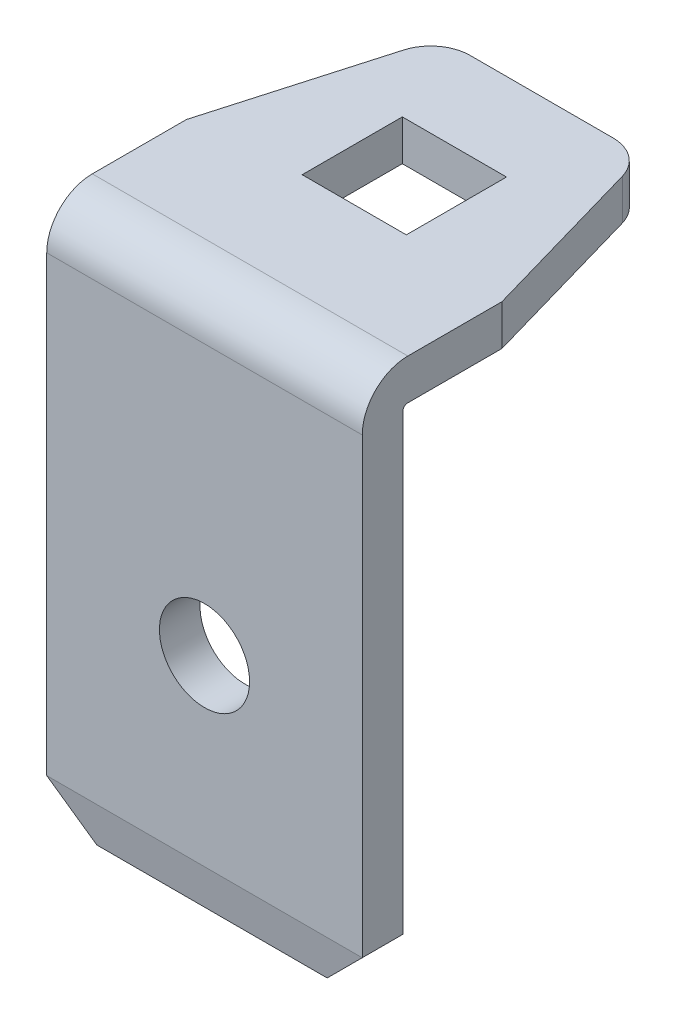
ISO-10303-21;
HEADER;
FILE_DESCRIPTION(('STEP AP214'),'2;1');
FILE_NAME('part.step','',(''),(''),'','','');
FILE_SCHEMA(('AUTOMOTIVE_DESIGN { 1 0 10303 214 1 1 1 1 }'));
ENDSEC;
DATA;
#1=APPLICATION_CONTEXT('core data for automotive mechanical design processes');
#2=APPLICATION_PROTOCOL_DEFINITION('international standard','automotive_design',2000,#1);
#3=PRODUCT_CONTEXT('',#1,'mechanical');
#4=PRODUCT('Part','Part','',(#3));
#5=PRODUCT_RELATED_PRODUCT_CATEGORY('part','',(#4));
#6=PRODUCT_DEFINITION_FORMATION('','',#4);
#7=PRODUCT_DEFINITION_CONTEXT('part definition',#1,'design');
#8=PRODUCT_DEFINITION('design','',#6,#7);
#9=PRODUCT_DEFINITION_SHAPE('','',#8);
#10=(LENGTH_UNIT() NAMED_UNIT(*) SI_UNIT(.MILLI.,.METRE.));
#11=(NAMED_UNIT(*) PLANE_ANGLE_UNIT() SI_UNIT($,.RADIAN.));
#12=(NAMED_UNIT(*) SI_UNIT($,.STERADIAN.) SOLID_ANGLE_UNIT());
#13=UNCERTAINTY_MEASURE_WITH_UNIT(LENGTH_MEASURE(1.E-05),#10,'distance_accuracy_value','');
#14=(GEOMETRIC_REPRESENTATION_CONTEXT(3) GLOBAL_UNCERTAINTY_ASSIGNED_CONTEXT((#13)) GLOBAL_UNIT_ASSIGNED_CONTEXT((#10,
#11,#12)) REPRESENTATION_CONTEXT('',''));
#15=CARTESIAN_POINT('',(0.,0.,0.));
#16=DIRECTION('',(0.,0.,1.));
#17=DIRECTION('',(1.,0.,0.));
#18=AXIS2_PLACEMENT_3D('',#15,#16,#17);
#19=CARTESIAN_POINT('',(6.092807699581,-20.94626181965,38.4492));
#20=DIRECTION('',(0.,-1.,0.));
#21=DIRECTION('',(0.,0.,-1.));
#22=AXIS2_PLACEMENT_3D('',#19,#20,#21);
#23=CYLINDRICAL_SURFACE('',#22,0.79);
#24=CARTESIAN_POINT('',(6.092807699581,-20.1192225422,38.4492));
#25=DIRECTION('',(0.,-1.,0.));
#26=DIRECTION('',(0.,0.,-1.));
#27=AXIS2_PLACEMENT_3D('',#24,#25,#26);
#28=CIRCLE('',#27,0.79);
#29=CARTESIAN_POINT('',(5.33341095978971,-20.1192225422,38.2314464889024));
#30=VERTEX_POINT('',#29);
#31=CARTESIAN_POINT('',(6.092807699581,-20.1192225422,37.6592));
#32=VERTEX_POINT('',#31);
#33=EDGE_CURVE('E293',#30,#32,#28,.T.);
#34=ORIENTED_EDGE('',*,*,#33,.T.);
#35=DIRECTION('',(0.,1.,0.));
#36=VECTOR('',#35,1.);
#37=CARTESIAN_POINT('',(6.092807699581,-20.5242225422,37.6592));
#38=LINE('',#37,#36);
#39=CARTESIAN_POINT('',(6.092807699581,-20.9292225422,37.6592));
#40=VERTEX_POINT('',#39);
#41=EDGE_CURVE('E333',#32,#40,#38,.F.);
#42=ORIENTED_EDGE('',*,*,#41,.T.);
#43=CARTESIAN_POINT('',(6.092807699581,-20.9292225422,38.4492));
#44=DIRECTION('',(0.,-1.,0.));
#45=DIRECTION('',(0.,0.,-1.));
#46=AXIS2_PLACEMENT_3D('',#43,#44,#45);
#47=CIRCLE('',#46,0.79);
#48=CARTESIAN_POINT('',(5.33341095978971,-20.9292225422,38.2314464889024));
#49=VERTEX_POINT('',#48);
#50=EDGE_CURVE('E273',#49,#40,#47,.T.);
#51=ORIENTED_EDGE('',*,*,#50,.F.);
#52=DIRECTION('',(0.,1.,0.));
#53=VECTOR('',#52,1.);
#54=CARTESIAN_POINT('',(5.33341095979072,-20.5242225422,38.2314464889002));
#55=LINE('',#54,#53);
#56=EDGE_CURVE('E319',#30,#49,#55,.F.);
#57=ORIENTED_EDGE('',*,*,#56,.F.);
#58=EDGE_LOOP('',(#34,#42,#51,#57));
#59=FACE_BOUND('',#58,.T.);
#60=ADVANCED_FACE('F16',(#59),#23,.T.);
#61=CARTESIAN_POINT('',(7.5175,-20.5242225422,37.6592));
#62=DIRECTION('',(0.,0.,1.));
#63=DIRECTION('',(1.,0.,0.));
#64=AXIS2_PLACEMENT_3D('',#61,#62,#63);
#65=PLANE('',#64);
#66=DIRECTION('',(0.,1.,0.));
#67=VECTOR('',#66,1.);
#68=CARTESIAN_POINT('',(8.942192300419,-20.10218326475,37.6592));
#69=LINE('',#68,#67);
#70=CARTESIAN_POINT('',(8.942192300419,-20.9292225422,37.6592));
#71=VERTEX_POINT('',#70);
#72=CARTESIAN_POINT('',(8.942192300419,-20.1192225422,37.6592));
#73=VERTEX_POINT('',#72);
#74=EDGE_CURVE('E327',#71,#73,#69,.T.);
#75=ORIENTED_EDGE('',*,*,#74,.F.);
#76=DIRECTION('',(1.,0.,0.));
#77=VECTOR('',#76,1.);
#78=CARTESIAN_POINT('',(7.5175,-20.9292225422,37.6592));
#79=LINE('',#78,#77);
#80=EDGE_CURVE('E270',#40,#71,#79,.T.);
#81=ORIENTED_EDGE('',*,*,#80,.F.);
#82=ORIENTED_EDGE('',*,*,#41,.F.);
#83=DIRECTION('',(1.,0.,0.));
#84=VECTOR('',#83,1.);
#85=CARTESIAN_POINT('',(7.5175,-20.1192225422,37.6592));
#86=LINE('',#85,#84);
#87=EDGE_CURVE('E291',#32,#73,#86,.T.);
#88=ORIENTED_EDGE('',*,*,#87,.T.);
#89=EDGE_LOOP('',(#75,#81,#82,#88));
#90=FACE_BOUND('',#89,.T.);
#91=ADVANCED_FACE('F393',(#90),#65,.F.);
#92=CARTESIAN_POINT('',(8.942192300419,-20.10218326475,38.4492));
#93=DIRECTION('',(0.,1.,0.));
#94=DIRECTION('',(0.,0.,1.));
#95=AXIS2_PLACEMENT_3D('',#92,#93,#94);
#96=CYLINDRICAL_SURFACE('',#95,0.79);
#97=CARTESIAN_POINT('',(8.942192300419,-20.9292225422,38.4492));
#98=DIRECTION('',(0.,1.,0.));
#99=DIRECTION('',(0.,0.,1.));
#100=AXIS2_PLACEMENT_3D('',#97,#98,#99);
#101=CIRCLE('',#100,0.79);
#102=CARTESIAN_POINT('',(9.70158904021172,-20.9292225422,38.231446488902));
#103=VERTEX_POINT('',#102);
#104=EDGE_CURVE('E267',#71,#103,#101,.F.);
#105=ORIENTED_EDGE('',*,*,#104,.F.);
#106=ORIENTED_EDGE('',*,*,#74,.T.);
#107=CARTESIAN_POINT('',(8.942192300419,-20.1192225422,38.4492));
#108=DIRECTION('',(0.,1.,0.));
#109=DIRECTION('',(0.,0.,1.));
#110=AXIS2_PLACEMENT_3D('',#107,#108,#109);
#111=CIRCLE('',#110,0.79);
#112=CARTESIAN_POINT('',(9.70158904021172,-20.1192225422,38.231446488902));
#113=VERTEX_POINT('',#112);
#114=EDGE_CURVE('E288',#73,#113,#111,.F.);
#115=ORIENTED_EDGE('',*,*,#114,.T.);
#116=DIRECTION('',(0.,1.,0.));
#117=VECTOR('',#116,1.);
#118=CARTESIAN_POINT('',(9.70158904021214,-20.5242225422,38.2314464888994));
#119=LINE('',#118,#117);
#120=EDGE_CURVE('E325',#113,#103,#119,.F.);
#121=ORIENTED_EDGE('',*,*,#120,.T.);
#122=EDGE_LOOP('',(#105,#106,#115,#121));
#123=FACE_BOUND('',#122,.T.);
#124=ADVANCED_FACE('F396',(#123),#96,.T.);
#125=CARTESIAN_POINT('',(10.18454452011,-20.5242225422,39.91571240522));
#126=DIRECTION('',(-0.961261695938003,0.,0.275637355818101));
#127=DIRECTION('',(0.275637355818101,0.,0.961261695938003));
#128=AXIS2_PLACEMENT_3D('',#125,#126,#127);
#129=PLANE('',#128);
#130=DIRECTION('',(0.275637355816688,0.,0.961261695938408));
#131=VECTOR('',#130,1.);
#132=CARTESIAN_POINT('',(9.70158904021,-20.9292225422,38.2314464889));
#133=LINE('',#132,#131);
#134=CARTESIAN_POINT('',(10.6675000000024,-20.9292225422,41.5999783215393));
#135=VERTEX_POINT('',#134);
#136=EDGE_CURVE('E264',#103,#135,#133,.T.);
#137=ORIENTED_EDGE('',*,*,#136,.F.);
#138=ORIENTED_EDGE('',*,*,#120,.F.);
#139=DIRECTION('',(0.275637355816688,0.,0.961261695938408));
#140=VECTOR('',#139,1.);
#141=CARTESIAN_POINT('',(9.70158904021,-20.1192225422,38.2314464889));
#142=LINE('',#141,#140);
#143=CARTESIAN_POINT('',(10.6675000000024,-20.1192225422,41.5999783215393));
#144=VERTEX_POINT('',#143);
#145=EDGE_CURVE('E285',#113,#144,#142,.T.);
#146=ORIENTED_EDGE('',*,*,#145,.T.);
#147=DIRECTION('',(0.,1.,0.));
#148=VECTOR('',#147,1.);
#149=CARTESIAN_POINT('',(10.6675000000071,-20.5242225422,41.599978321538));
#150=LINE('',#149,#148);
#151=EDGE_CURVE('E324',#135,#144,#150,.T.);
#152=ORIENTED_EDGE('',*,*,#151,.F.);
#153=EDGE_LOOP('',(#137,#138,#146,#152));
#154=FACE_BOUND('',#153,.T.);
#155=ADVANCED_FACE('F356',(#154),#129,.F.);
#156=CARTESIAN_POINT('',(4.850455479895,-20.5242225422,39.91571240522));
#157=DIRECTION('',(-0.961261695938291,0.,-0.275637355817097));
#158=DIRECTION('',(-0.275637355817097,0.,0.961261695938291));
#159=AXIS2_PLACEMENT_3D('',#156,#157,#158);
#160=PLANE('',#159);
#161=DIRECTION('',(0.,1.,0.));
#162=VECTOR('',#161,1.);
#163=CARTESIAN_POINT('',(4.36749999999928,-20.5242225422,41.5999783215398));
#164=LINE('',#163,#162);
#165=CARTESIAN_POINT('',(4.36749999999976,-20.9292225422,41.5999783215399));
#166=VERTEX_POINT('',#165);
#167=CARTESIAN_POINT('',(4.36749999999976,-20.1192225422,41.5999783215399));
#168=VERTEX_POINT('',#167);
#169=EDGE_CURVE('E317',#166,#168,#164,.T.);
#170=ORIENTED_EDGE('',*,*,#169,.T.);
#171=DIRECTION('',(0.275637355816688,0.,-0.961261695938408));
#172=VECTOR('',#171,1.);
#173=CARTESIAN_POINT('',(4.3675,-20.1192225422,41.59997832154));
#174=LINE('',#173,#172);
#175=EDGE_CURVE('E294',#168,#30,#174,.T.);
#176=ORIENTED_EDGE('',*,*,#175,.T.);
#177=ORIENTED_EDGE('',*,*,#56,.T.);
#178=DIRECTION('',(0.275637355816688,0.,-0.961261695938408));
#179=VECTOR('',#178,1.);
#180=CARTESIAN_POINT('',(4.3675,-20.9292225422,41.59997832154));
#181=LINE('',#180,#179);
#182=EDGE_CURVE('E258',#166,#49,#181,.T.);
#183=ORIENTED_EDGE('',*,*,#182,.F.);
#184=EDGE_LOOP('',(#170,#176,#177,#183));
#185=FACE_BOUND('',#184,.T.);
#186=ADVANCED_FACE('F386',(#185),#160,.T.);
#187=CARTESIAN_POINT('',(7.5175,-20.5242225422,41.3992));
#188=DIRECTION('',(0.,0.,1.));
#189=DIRECTION('',(1.,0.,0.));
#190=AXIS2_PLACEMENT_3D('',#187,#188,#189);
#191=PLANE('',#190);
#192=DIRECTION('',(1.,0.,0.));
#193=VECTOR('',#192,1.);
#194=CARTESIAN_POINT('',(7.5175,-20.1192225422,41.3992));
#195=LINE('',#194,#193);
#196=CARTESIAN_POINT('',(6.4775,-20.1192225422,41.3992));
#197=VERTEX_POINT('',#196);
#198=CARTESIAN_POINT('',(8.5575,-20.1192225422,41.3992));
#199=VERTEX_POINT('',#198);
#200=EDGE_CURVE('E280',#197,#199,#195,.T.);
#201=ORIENTED_EDGE('',*,*,#200,.T.);
#202=DIRECTION('',(0.,1.,0.));
#203=VECTOR('',#202,1.);
#204=CARTESIAN_POINT('',(8.5575,-20.5242225422,41.3992));
#205=LINE('',#204,#203);
#206=CARTESIAN_POINT('',(8.5575,-20.9292225422,41.3992));
#207=VERTEX_POINT('',#206);
#208=EDGE_CURVE('E314',#207,#199,#205,.T.);
#209=ORIENTED_EDGE('',*,*,#208,.F.);
#210=DIRECTION('',(1.,0.,0.));
#211=VECTOR('',#210,1.);
#212=CARTESIAN_POINT('',(7.5175,-20.9292225422,41.3992));
#213=LINE('',#212,#211);
#214=CARTESIAN_POINT('',(6.4775,-20.9292225422,41.3992));
#215=VERTEX_POINT('',#214);
#216=EDGE_CURVE('E255',#215,#207,#213,.T.);
#217=ORIENTED_EDGE('',*,*,#216,.F.);
#218=DIRECTION('',(0.,1.,0.));
#219=VECTOR('',#218,1.);
#220=CARTESIAN_POINT('',(6.4775,-20.5242225422,41.3992));
#221=LINE('',#220,#219);
#222=EDGE_CURVE('E309',#215,#197,#221,.T.);
#223=ORIENTED_EDGE('',*,*,#222,.T.);
#224=EDGE_LOOP('',(#201,#209,#217,#223));
#225=FACE_BOUND('',#224,.T.);
#226=ADVANCED_FACE('F453',(#225),#191,.F.);
#227=CARTESIAN_POINT('',(8.5575,-20.5242225422,40.3992));
#228=DIRECTION('',(-1.,0.,0.));
#229=DIRECTION('',(0.,0.,1.));
#230=AXIS2_PLACEMENT_3D('',#227,#228,#229);
#231=PLANE('',#230);
#232=DIRECTION('',(0.,1.,0.));
#233=VECTOR('',#232,1.);
#234=CARTESIAN_POINT('',(8.5575,-20.5242225422,39.3992));
#235=LINE('',#234,#233);
#236=CARTESIAN_POINT('',(8.5575,-20.9292225422,39.3992));
#237=VERTEX_POINT('',#236);
#238=CARTESIAN_POINT('',(8.5575,-20.1192225422,39.3992));
#239=VERTEX_POINT('',#238);
#240=EDGE_CURVE('E311',#237,#239,#235,.T.);
#241=ORIENTED_EDGE('',*,*,#240,.F.);
#242=DIRECTION('',(0.,0.,-1.));
#243=VECTOR('',#242,1.);
#244=CARTESIAN_POINT('',(8.5575,-20.9292225422,40.5692));
#245=LINE('',#244,#243);
#246=EDGE_CURVE('E252',#207,#237,#245,.T.);
#247=ORIENTED_EDGE('',*,*,#246,.F.);
#248=ORIENTED_EDGE('',*,*,#208,.T.);
#249=DIRECTION('',(0.,0.,-1.));
#250=VECTOR('',#249,1.);
#251=CARTESIAN_POINT('',(8.5575,-20.1192225422,40.5692));
#252=LINE('',#251,#250);
#253=EDGE_CURVE('E278',#199,#239,#252,.T.);
#254=ORIENTED_EDGE('',*,*,#253,.T.);
#255=EDGE_LOOP('',(#241,#247,#248,#254));
#256=FACE_BOUND('',#255,.T.);
#257=ADVANCED_FACE('F449',(#256),#231,.T.);
#258=CARTESIAN_POINT('',(7.5175,-20.5242225422,39.3992));
#259=DIRECTION('',(0.,0.,1.));
#260=DIRECTION('',(1.,0.,0.));
#261=AXIS2_PLACEMENT_3D('',#258,#259,#260);
#262=PLANE('',#261);
#263=DIRECTION('',(0.,1.,0.));
#264=VECTOR('',#263,1.);
#265=CARTESIAN_POINT('',(6.4775,-20.5242225422,39.3992));
#266=LINE('',#265,#264);
#267=CARTESIAN_POINT('',(6.4775,-20.1192225422,39.3992));
#268=VERTEX_POINT('',#267);
#269=CARTESIAN_POINT('',(6.4775,-20.9292225422,39.3992));
#270=VERTEX_POINT('',#269);
#271=EDGE_CURVE('E149',#268,#270,#266,.F.);
#272=ORIENTED_EDGE('',*,*,#271,.T.);
#273=DIRECTION('',(1.,0.,0.));
#274=VECTOR('',#273,1.);
#275=CARTESIAN_POINT('',(7.5175,-20.9292225422,39.3992));
#276=LINE('',#275,#274);
#277=EDGE_CURVE('E249',#237,#270,#276,.F.);
#278=ORIENTED_EDGE('',*,*,#277,.F.);
#279=ORIENTED_EDGE('',*,*,#240,.T.);
#280=DIRECTION('',(1.,0.,0.));
#281=VECTOR('',#280,1.);
#282=CARTESIAN_POINT('',(7.5175,-20.1192225422,39.3992));
#283=LINE('',#282,#281);
#284=EDGE_CURVE('E275',#239,#268,#283,.F.);
#285=ORIENTED_EDGE('',*,*,#284,.T.);
#286=EDGE_LOOP('',(#272,#278,#279,#285));
#287=FACE_BOUND('',#286,.T.);
#288=ADVANCED_FACE('F445',(#287),#262,.T.);
#289=CARTESIAN_POINT('',(6.4775,-20.5242225422,40.3992));
#290=DIRECTION('',(-1.,0.,0.));
#291=DIRECTION('',(0.,0.,1.));
#292=AXIS2_PLACEMENT_3D('',#289,#290,#291);
#293=PLANE('',#292);
#294=DIRECTION('',(0.,0.,-1.));
#295=VECTOR('',#294,1.);
#296=CARTESIAN_POINT('',(6.4775,-20.1192225422,40.5692));
#297=LINE('',#296,#295);
#298=EDGE_CURVE('E282',#268,#197,#297,.F.);
#299=ORIENTED_EDGE('',*,*,#298,.T.);
#300=ORIENTED_EDGE('',*,*,#222,.F.);
#301=DIRECTION('',(0.,0.,-1.));
#302=VECTOR('',#301,1.);
#303=CARTESIAN_POINT('',(6.4775,-20.9292225422,40.5692));
#304=LINE('',#303,#302);
#305=EDGE_CURVE('E246',#270,#215,#304,.F.);
#306=ORIENTED_EDGE('',*,*,#305,.F.);
#307=ORIENTED_EDGE('',*,*,#271,.F.);
#308=EDGE_LOOP('',(#299,#300,#306,#307));
#309=FACE_BOUND('',#308,.T.);
#310=ADVANCED_FACE('F442',(#309),#293,.F.);
#311=CARTESIAN_POINT('',(7.5175,-30.4942225422,43.6541389668));
#312=DIRECTION('',(0.,0.173648177660102,0.984807753013412));
#313=DIRECTION('',(0.,-0.984807753013412,0.173648177660102));
#314=AXIS2_PLACEMENT_3D('',#311,#312,#313);
#315=PLANE('',#314);
#316=DIRECTION('',(1.,0.,0.));
#317=VECTOR('',#316,1.);
#318=CARTESIAN_POINT('',(7.5175,-30.9192225422,43.7290779336));
#319=LINE('',#318,#317);
#320=CARTESIAN_POINT('',(5.2175,-30.9192225422,43.7290779336));
#321=VERTEX_POINT('',#320);
#322=CARTESIAN_POINT('',(9.8175,-30.9192225422,43.7290779336));
#323=VERTEX_POINT('',#322);
#324=EDGE_CURVE('E230',#321,#323,#319,.T.);
#325=ORIENTED_EDGE('',*,*,#324,.F.);
#326=DIRECTION('',(0.701673843160021,-0.70167384316002,0.123724030204701));
#327=VECTOR('',#326,1.);
#328=CARTESIAN_POINT('',(4.3675,-30.0692225422,43.5792));
#329=LINE('',#328,#327);
#330=CARTESIAN_POINT('',(4.3675,-30.0692225422,43.5792));
#331=VERTEX_POINT('',#330);
#332=EDGE_CURVE('E231',#331,#321,#329,.T.);
#333=ORIENTED_EDGE('',*,*,#332,.F.);
#334=DIRECTION('',(1.,0.,0.));
#335=VECTOR('',#334,1.);
#336=CARTESIAN_POINT('',(7.5175,-30.0692225422,43.5792));
#337=LINE('',#336,#335);
#338=CARTESIAN_POINT('',(10.6675,-30.0692225422,43.5792));
#339=VERTEX_POINT('',#338);
#340=EDGE_CURVE('E157',#331,#339,#337,.T.);
#341=ORIENTED_EDGE('',*,*,#340,.T.);
#342=DIRECTION('',(-0.70167384316002,-0.70167384316002,0.123724030204701));
#343=VECTOR('',#342,1.);
#344=CARTESIAN_POINT('',(10.6675,-30.0692225422,43.5792));
#345=LINE('',#344,#343);
#346=EDGE_CURVE('E240',#339,#323,#345,.T.);
#347=ORIENTED_EDGE('',*,*,#346,.T.);
#348=EDGE_LOOP('',(#325,#333,#341,#347));
#349=FACE_BOUND('',#348,.T.);
#350=ADVANCED_FACE('F382',(#349),#315,.F.);
#351=CARTESIAN_POINT('',(4.2415,-21.0292225422,43.4792));
#352=DIRECTION('',(-1.,0.,0.));
#353=DIRECTION('',(0.,0.,1.));
#354=AXIS2_PLACEMENT_3D('',#351,#352,#353);
#355=CYLINDRICAL_SURFACE('',#354,0.1);
#356=DIRECTION('',(1.,0.,0.));
#357=VECTOR('',#356,1.);
#358=CARTESIAN_POINT('',(7.5175,-21.0292225422,43.5792));
#359=LINE('',#358,#357);
#360=CARTESIAN_POINT('',(10.6675,-21.0292225422,43.5792));
#361=VERTEX_POINT('',#360);
#362=CARTESIAN_POINT('',(4.3675,-21.0292225422,43.5792));
#363=VERTEX_POINT('',#362);
#364=EDGE_CURVE('E151',#361,#363,#359,.F.);
#365=ORIENTED_EDGE('',*,*,#364,.T.);
#366=CARTESIAN_POINT('',(4.3675,-21.0292225422,43.4792));
#367=DIRECTION('',(-1.,0.,0.));
#368=DIRECTION('',(0.,0.,1.));
#369=AXIS2_PLACEMENT_3D('',#366,#367,#368);
#370=CIRCLE('',#369,0.1);
#371=CARTESIAN_POINT('',(4.3675,-20.9292225422,43.4792));
#372=VERTEX_POINT('',#371);
#373=EDGE_CURVE('E19',#372,#363,#370,.F.);
#374=ORIENTED_EDGE('',*,*,#373,.F.);
#375=DIRECTION('',(1.,0.,0.));
#376=VECTOR('',#375,1.);
#377=CARTESIAN_POINT('',(7.5175,-20.9292225422,43.4792));
#378=LINE('',#377,#376);
#379=CARTESIAN_POINT('',(10.6675,-20.9292225422,43.4792));
#380=VERTEX_POINT('',#379);
#381=EDGE_CURVE('E261',#380,#372,#378,.F.);
#382=ORIENTED_EDGE('',*,*,#381,.F.);
#383=CARTESIAN_POINT('',(10.6675,-21.0292225422,43.4792));
#384=DIRECTION('',(-1.,0.,0.));
#385=DIRECTION('',(0.,0.,1.));
#386=AXIS2_PLACEMENT_3D('',#383,#384,#385);
#387=CIRCLE('',#386,0.1);
#388=EDGE_CURVE('E148',#361,#380,#387,.T.);
#389=ORIENTED_EDGE('',*,*,#388,.F.);
#390=EDGE_LOOP('',(#365,#374,#382,#389));
#391=FACE_BOUND('',#390,.T.);
#392=ADVANCED_FACE('F152',(#391),#355,.F.);
#393=CARTESIAN_POINT('',(7.5175,-20.1192225422,40.5692));
#394=DIRECTION('',(0.,-1.,0.));
#395=DIRECTION('',(0.,0.,-1.));
#396=AXIS2_PLACEMENT_3D('',#393,#394,#395);
#397=PLANE('',#396);
#398=ORIENTED_EDGE('',*,*,#253,.F.);
#399=ORIENTED_EDGE('',*,*,#200,.F.);
#400=ORIENTED_EDGE('',*,*,#298,.F.);
#401=ORIENTED_EDGE('',*,*,#284,.F.);
#402=EDGE_LOOP('',(#398,#399,#400,#401));
#403=FACE_BOUND('',#402,.T.);
#404=DIRECTION('',(1.,0.,0.));
#405=VECTOR('',#404,1.);
#406=CARTESIAN_POINT('',(10.7935,-20.1192225422,43.4792));
#407=LINE('',#406,#405);
#408=CARTESIAN_POINT('',(10.6675,-20.1192225422,43.4792));
#409=VERTEX_POINT('',#408);
#410=CARTESIAN_POINT('',(4.3675,-20.1192225422,43.4792));
#411=VERTEX_POINT('',#410);
#412=EDGE_CURVE('E299',#409,#411,#407,.F.);
#413=ORIENTED_EDGE('',*,*,#412,.F.);
#414=DIRECTION('',(0.,0.,1.));
#415=VECTOR('',#414,1.);
#416=CARTESIAN_POINT('',(10.6675,-20.1192225422,42.99458916077));
#417=LINE('',#416,#415);
#418=EDGE_CURVE('E209',#409,#144,#417,.F.);
#419=ORIENTED_EDGE('',*,*,#418,.T.);
#420=ORIENTED_EDGE('',*,*,#145,.F.);
#421=ORIENTED_EDGE('',*,*,#114,.F.);
#422=ORIENTED_EDGE('',*,*,#87,.F.);
#423=ORIENTED_EDGE('',*,*,#33,.F.);
#424=ORIENTED_EDGE('',*,*,#175,.F.);
#425=DIRECTION('',(0.,0.,1.));
#426=VECTOR('',#425,1.);
#427=CARTESIAN_POINT('',(4.3675,-20.1192225422,42.99458916077));
#428=LINE('',#427,#426);
#429=EDGE_CURVE('E165',#411,#168,#428,.F.);
#430=ORIENTED_EDGE('',*,*,#429,.F.);
#431=EDGE_LOOP('',(#413,#419,#420,#421,#422,#423,#424,#430));
#432=FACE_BOUND('',#431,.T.);
#433=ADVANCED_FACE('F363',(#403,#432),#397,.F.);
#434=CARTESIAN_POINT('',(7.5175,-20.9292225422,40.5692));
#435=DIRECTION('',(0.,-1.,0.));
#436=DIRECTION('',(0.,0.,-1.));
#437=AXIS2_PLACEMENT_3D('',#434,#435,#436);
#438=PLANE('',#437);
#439=ORIENTED_EDGE('',*,*,#277,.T.);
#440=ORIENTED_EDGE('',*,*,#305,.T.);
#441=ORIENTED_EDGE('',*,*,#216,.T.);
#442=ORIENTED_EDGE('',*,*,#246,.T.);
#443=EDGE_LOOP('',(#439,#440,#441,#442));
#444=FACE_BOUND('',#443,.T.);
#445=DIRECTION('',(0.,0.,1.));
#446=VECTOR('',#445,1.);
#447=CARTESIAN_POINT('',(4.3675,-20.9292225422,42.99458916077));
#448=LINE('',#447,#446);
#449=EDGE_CURVE('E147',#166,#372,#448,.T.);
#450=ORIENTED_EDGE('',*,*,#449,.F.);
#451=ORIENTED_EDGE('',*,*,#182,.T.);
#452=ORIENTED_EDGE('',*,*,#50,.T.);
#453=ORIENTED_EDGE('',*,*,#80,.T.);
#454=ORIENTED_EDGE('',*,*,#104,.T.);
#455=ORIENTED_EDGE('',*,*,#136,.T.);
#456=DIRECTION('',(0.,0.,1.));
#457=VECTOR('',#456,1.);
#458=CARTESIAN_POINT('',(10.6675,-20.9292225422,42.99458916077));
#459=LINE('',#458,#457);
#460=EDGE_CURVE('E204',#135,#380,#459,.T.);
#461=ORIENTED_EDGE('',*,*,#460,.T.);
#462=ORIENTED_EDGE('',*,*,#381,.T.);
#463=EDGE_LOOP('',(#450,#451,#452,#453,#454,#455,#461,#462));
#464=FACE_BOUND('',#463,.T.);
#465=ADVANCED_FACE('F351',(#444,#464),#438,.T.);
#466=CARTESIAN_POINT('',(10.2425,-30.4942225422,43.9842));
#467=DIRECTION('',(-0.707106781186548,0.707106781186548,0.));
#468=DIRECTION('',(-0.707106781186548,-0.707106781186548,0.));
#469=AXIS2_PLACEMENT_3D('',#466,#467,#468);
#470=PLANE('',#469);
#471=ORIENTED_EDGE('',*,*,#346,.F.);
#472=DIRECTION('',(0.,0.,1.));
#473=VECTOR('',#472,1.);
#474=CARTESIAN_POINT('',(10.6675,-30.0692225422,42.99458916077));
#475=LINE('',#474,#473);
#476=CARTESIAN_POINT('',(10.6675,-30.0692225421999,44.3891999999995));
#477=VERTEX_POINT('',#476);
#478=EDGE_CURVE('E156',#339,#477,#475,.T.);
#479=ORIENTED_EDGE('',*,*,#478,.T.);
#480=DIRECTION('',(0.701673843160019,0.70167384316057,0.123724030201591));
#481=VECTOR('',#480,1.);
#482=CARTESIAN_POINT('',(9.8175,-30.9192225422003,44.2393220664019));
#483=LINE('',#482,#481);
#484=CARTESIAN_POINT('',(9.8175,-30.9192225422002,44.2393220664019));
#485=VERTEX_POINT('',#484);
#486=EDGE_CURVE('E163',#485,#477,#483,.T.);
#487=ORIENTED_EDGE('',*,*,#486,.F.);
#488=DIRECTION('',(0.,0.,-1.));
#489=VECTOR('',#488,1.);
#490=CARTESIAN_POINT('',(9.8175,-30.9192225422,43.9842));
#491=LINE('',#490,#489);
#492=EDGE_CURVE('E234',#323,#485,#491,.F.);
#493=ORIENTED_EDGE('',*,*,#492,.F.);
#494=EDGE_LOOP('',(#471,#479,#487,#493));
#495=FACE_BOUND('',#494,.T.);
#496=ADVANCED_FACE('F377',(#495),#470,.F.);
#497=CARTESIAN_POINT('',(4.7925,-30.4942225422,43.9842));
#498=DIRECTION('',(-0.707106781186548,-0.707106781186548,0.));
#499=DIRECTION('',(0.707106781186548,-0.707106781186548,0.));
#500=AXIS2_PLACEMENT_3D('',#497,#498,#499);
#501=PLANE('',#500);
#502=DIRECTION('',(0.,0.,-1.));
#503=VECTOR('',#502,1.);
#504=CARTESIAN_POINT('',(5.2175,-30.9192225422,43.9842));
#505=LINE('',#504,#503);
#506=CARTESIAN_POINT('',(5.2175,-30.9192225422002,44.2393220664019));
#507=VERTEX_POINT('',#506);
#508=EDGE_CURVE('E227',#507,#321,#505,.T.);
#509=ORIENTED_EDGE('',*,*,#508,.F.);
#510=DIRECTION('',(0.70167384316002,-0.701673843160569,-0.123724030201591));
#511=VECTOR('',#510,1.);
#512=CARTESIAN_POINT('',(4.3675,-30.0692225421997,44.3891999999981));
#513=LINE('',#512,#511);
#514=CARTESIAN_POINT('',(4.36749999999998,-30.0692225421999,44.3891999999995));
#515=VERTEX_POINT('',#514);
#516=EDGE_CURVE('E34',#515,#507,#513,.T.);
#517=ORIENTED_EDGE('',*,*,#516,.F.);
#518=DIRECTION('',(0.,0.,1.));
#519=VECTOR('',#518,1.);
#520=CARTESIAN_POINT('',(4.3675,-30.0692225422,42.99458916077));
#521=LINE('',#520,#519);
#522=EDGE_CURVE('E161',#331,#515,#521,.T.);
#523=ORIENTED_EDGE('',*,*,#522,.F.);
#524=ORIENTED_EDGE('',*,*,#332,.T.);
#525=EDGE_LOOP('',(#509,#517,#523,#524));
#526=FACE_BOUND('',#525,.T.);
#527=ADVANCED_FACE('F383',(#526),#501,.T.);
#528=CARTESIAN_POINT('',(7.5175,-30.9192225422,43.9842));
#529=DIRECTION('',(0.,-1.,0.));
#530=DIRECTION('',(0.,0.,-1.));
#531=AXIS2_PLACEMENT_3D('',#528,#529,#530);
#532=PLANE('',#531);
#533=ORIENTED_EDGE('',*,*,#324,.T.);
#534=ORIENTED_EDGE('',*,*,#492,.T.);
#535=DIRECTION('',(1.,0.,0.));
#536=VECTOR('',#535,1.);
#537=CARTESIAN_POINT('',(7.5175,-30.9192225422003,44.2393220664019));
#538=LINE('',#537,#536);
#539=EDGE_CURVE('E193',#507,#485,#538,.T.);
#540=ORIENTED_EDGE('',*,*,#539,.F.);
#541=ORIENTED_EDGE('',*,*,#508,.T.);
#542=EDGE_LOOP('',(#533,#534,#540,#541));
#543=FACE_BOUND('',#542,.T.);
#544=ADVANCED_FACE('F379',(#543),#532,.T.);
#545=CARTESIAN_POINT('',(7.5175,-25.5492225422,43.5792));
#546=DIRECTION('',(0.,0.,1.));
#547=DIRECTION('',(1.,0.,0.));
#548=AXIS2_PLACEMENT_3D('',#545,#546,#547);
#549=PLANE('',#548);
#550=CARTESIAN_POINT('',(7.5175,-26.4192225422,43.5792));
#551=DIRECTION('',(0.,0.,1.));
#552=DIRECTION('',(1.,0.,0.));
#553=AXIS2_PLACEMENT_3D('',#550,#551,#552);
#554=CIRCLE('',#553,0.9);
#555=CARTESIAN_POINT('',(8.4175,-26.4192225422,43.5792));
#556=VERTEX_POINT('',#555);
#557=EDGE_CURVE('E198',#556,#556,#554,.T.);
#558=ORIENTED_EDGE('',*,*,#557,.T.);
#559=EDGE_LOOP('',(#558));
#560=FACE_BOUND('',#559,.T.);
#561=ORIENTED_EDGE('',*,*,#364,.F.);
#562=DIRECTION('',(0.,1.,0.));
#563=VECTOR('',#562,1.);
#564=CARTESIAN_POINT('',(10.6675,-25.0942225422,43.5792));
#565=LINE('',#564,#563);
#566=EDGE_CURVE('E201',#361,#339,#565,.F.);
#567=ORIENTED_EDGE('',*,*,#566,.T.);
#568=ORIENTED_EDGE('',*,*,#340,.F.);
#569=DIRECTION('',(0.,1.,0.));
#570=VECTOR('',#569,1.);
#571=CARTESIAN_POINT('',(4.3675,-25.0942225422,43.5792));
#572=LINE('',#571,#570);
#573=EDGE_CURVE('E145',#363,#331,#572,.F.);
#574=ORIENTED_EDGE('',*,*,#573,.F.);
#575=EDGE_LOOP('',(#561,#567,#568,#574));
#576=FACE_BOUND('',#575,.T.);
#577=ADVANCED_FACE('F160',(#560,#576),#549,.F.);
#578=CARTESIAN_POINT('',(10.6675,-25.0942225422,42.99458916077));
#579=DIRECTION('',(-1.,0.,0.));
#580=DIRECTION('',(0.,0.,1.));
#581=AXIS2_PLACEMENT_3D('',#578,#579,#580);
#582=PLANE('',#581);
#583=ORIENTED_EDGE('',*,*,#388,.T.);
#584=ORIENTED_EDGE('',*,*,#460,.F.);
#585=ORIENTED_EDGE('',*,*,#151,.T.);
#586=ORIENTED_EDGE('',*,*,#418,.F.);
#587=CARTESIAN_POINT('',(10.6675,-21.0292225422,43.4792));
#588=DIRECTION('',(1.,0.,0.));
#589=DIRECTION('',(0.,0.,-1.));
#590=AXIS2_PLACEMENT_3D('',#587,#588,#589);
#591=CIRCLE('',#590,0.91);
#592=CARTESIAN_POINT('',(10.6675,-21.0292225422,44.3892));
#593=VERTEX_POINT('',#592);
#594=EDGE_CURVE('E203',#593,#409,#591,.F.);
#595=ORIENTED_EDGE('',*,*,#594,.F.);
#596=DIRECTION('',(0.,1.,0.));
#597=VECTOR('',#596,1.);
#598=CARTESIAN_POINT('',(10.6675,-25.5492225422,44.3892));
#599=LINE('',#598,#597);
#600=EDGE_CURVE('E181',#477,#593,#599,.T.);
#601=ORIENTED_EDGE('',*,*,#600,.F.);
#602=ORIENTED_EDGE('',*,*,#478,.F.);
#603=ORIENTED_EDGE('',*,*,#566,.F.);
#604=EDGE_LOOP('',(#583,#584,#585,#586,#595,#601,#602,#603));
#605=FACE_BOUND('',#604,.T.);
#606=ADVANCED_FACE('F348',(#605),#582,.F.);
#607=CARTESIAN_POINT('',(10.7935,-21.0292225422,43.4792));
#608=DIRECTION('',(1.,0.,0.));
#609=DIRECTION('',(0.,0.,-1.));
#610=AXIS2_PLACEMENT_3D('',#607,#608,#609);
#611=CYLINDRICAL_SURFACE('',#610,0.91);
#612=CARTESIAN_POINT('',(4.3675,-21.0292225422,43.4792));
#613=DIRECTION('',(1.,0.,0.));
#614=DIRECTION('',(0.,0.,-1.));
#615=AXIS2_PLACEMENT_3D('',#612,#613,#614);
#616=CIRCLE('',#615,0.91);
#617=CARTESIAN_POINT('',(4.3675,-21.0292225422,44.3892));
#618=VERTEX_POINT('',#617);
#619=EDGE_CURVE('E174',#618,#411,#616,.F.);
#620=ORIENTED_EDGE('',*,*,#619,.F.);
#621=DIRECTION('',(1.,0.,0.));
#622=VECTOR('',#621,1.);
#623=CARTESIAN_POINT('',(7.5175,-21.0292225422,44.3892));
#624=LINE('',#623,#622);
#625=EDGE_CURVE('E177',#593,#618,#624,.F.);
#626=ORIENTED_EDGE('',*,*,#625,.F.);
#627=ORIENTED_EDGE('',*,*,#594,.T.);
#628=ORIENTED_EDGE('',*,*,#412,.T.);
#629=EDGE_LOOP('',(#620,#626,#627,#628));
#630=FACE_BOUND('',#629,.T.);
#631=ADVANCED_FACE('F366',(#630),#611,.T.);
#632=CARTESIAN_POINT('',(4.3675,-25.0942225422,42.99458916077));
#633=DIRECTION('',(-1.,0.,0.));
#634=DIRECTION('',(0.,0.,1.));
#635=AXIS2_PLACEMENT_3D('',#632,#633,#634);
#636=PLANE('',#635);
#637=ORIENTED_EDGE('',*,*,#573,.T.);
#638=ORIENTED_EDGE('',*,*,#522,.T.);
#639=DIRECTION('',(0.,1.,0.));
#640=VECTOR('',#639,1.);
#641=CARTESIAN_POINT('',(4.3675,-25.5492225422,44.3892));
#642=LINE('',#641,#640);
#643=EDGE_CURVE('E180',#618,#515,#642,.F.);
#644=ORIENTED_EDGE('',*,*,#643,.F.);
#645=ORIENTED_EDGE('',*,*,#619,.T.);
#646=ORIENTED_EDGE('',*,*,#429,.T.);
#647=ORIENTED_EDGE('',*,*,#169,.F.);
#648=ORIENTED_EDGE('',*,*,#449,.T.);
#649=ORIENTED_EDGE('',*,*,#373,.T.);
#650=EDGE_LOOP('',(#637,#638,#644,#645,#646,#647,#648,#649));
#651=FACE_BOUND('',#650,.T.);
#652=ADVANCED_FACE('F143',(#651),#636,.T.);
#653=CARTESIAN_POINT('',(7.5175,-30.4942225422,44.3142610332));
#654=DIRECTION('',(0.,-0.173648177660102,0.984807753013412));
#655=DIRECTION('',(0.,-0.984807753013412,-0.173648177660102));
#656=AXIS2_PLACEMENT_3D('',#653,#654,#655);
#657=PLANE('',#656);
#658=ORIENTED_EDGE('',*,*,#516,.T.);
#659=ORIENTED_EDGE('',*,*,#539,.T.);
#660=ORIENTED_EDGE('',*,*,#486,.T.);
#661=DIRECTION('',(1.,0.,0.));
#662=VECTOR('',#661,1.);
#663=CARTESIAN_POINT('',(7.5175,-30.0692225422,44.3892));
#664=LINE('',#663,#662);
#665=EDGE_CURVE('E25',#515,#477,#664,.T.);
#666=ORIENTED_EDGE('',*,*,#665,.F.);
#667=EDGE_LOOP('',(#658,#659,#660,#666));
#668=FACE_BOUND('',#667,.T.);
#669=ADVANCED_FACE('F372',(#668),#657,.T.);
#670=CARTESIAN_POINT('',(7.5175,-26.4192225422,44.40623927745));
#671=DIRECTION('',(0.,0.,1.));
#672=DIRECTION('',(1.,0.,0.));
#673=AXIS2_PLACEMENT_3D('',#670,#671,#672);
#674=CYLINDRICAL_SURFACE('',#673,0.9);
#675=CARTESIAN_POINT('',(7.5175,-26.4192225422,44.3892));
#676=DIRECTION('',(0.,0.,1.));
#677=DIRECTION('',(1.,0.,0.));
#678=AXIS2_PLACEMENT_3D('',#675,#676,#677);
#679=CIRCLE('',#678,0.9);
#680=CARTESIAN_POINT('',(8.4175,-26.4192225422,44.3892));
#681=VERTEX_POINT('',#680);
#682=EDGE_CURVE('E11',#681,#681,#679,.F.);
#683=ORIENTED_EDGE('',*,*,#682,.F.);
#684=EDGE_LOOP('',(#683));
#685=FACE_BOUND('',#684,.T.);
#686=ORIENTED_EDGE('',*,*,#557,.F.);
#687=EDGE_LOOP('',(#686));
#688=FACE_BOUND('',#687,.T.);
#689=ADVANCED_FACE('F406',(#685,#688),#674,.F.);
#690=CARTESIAN_POINT('',(7.5175,-25.5492225422,44.3892));
#691=DIRECTION('',(0.,0.,1.));
#692=DIRECTION('',(1.,0.,0.));
#693=AXIS2_PLACEMENT_3D('',#690,#691,#692);
#694=PLANE('',#693);
#695=ORIENTED_EDGE('',*,*,#682,.T.);
#696=EDGE_LOOP('',(#695));
#697=FACE_BOUND('',#696,.T.);
#698=ORIENTED_EDGE('',*,*,#643,.T.);
#699=ORIENTED_EDGE('',*,*,#665,.T.);
#700=ORIENTED_EDGE('',*,*,#600,.T.);
#701=ORIENTED_EDGE('',*,*,#625,.T.);
#702=EDGE_LOOP('',(#698,#699,#700,#701));
#703=FACE_BOUND('',#702,.T.);
#704=ADVANCED_FACE('F369',(#697,#703),#694,.T.);
#705=CLOSED_SHELL('',(#60,#91,#124,#155,#186,#226,#257,#288,#310,#350,#392,#433,#465,#496,#527,
#544,#577,#606,#631,#652,#669,#689,#704));
#706=MANIFOLD_SOLID_BREP('B1',#705);
#707=ADVANCED_BREP_SHAPE_REPRESENTATION('',(#18,#706),#14);
#708=SHAPE_DEFINITION_REPRESENTATION(#9,#707);
ENDSEC;
END-ISO-10303-21;
